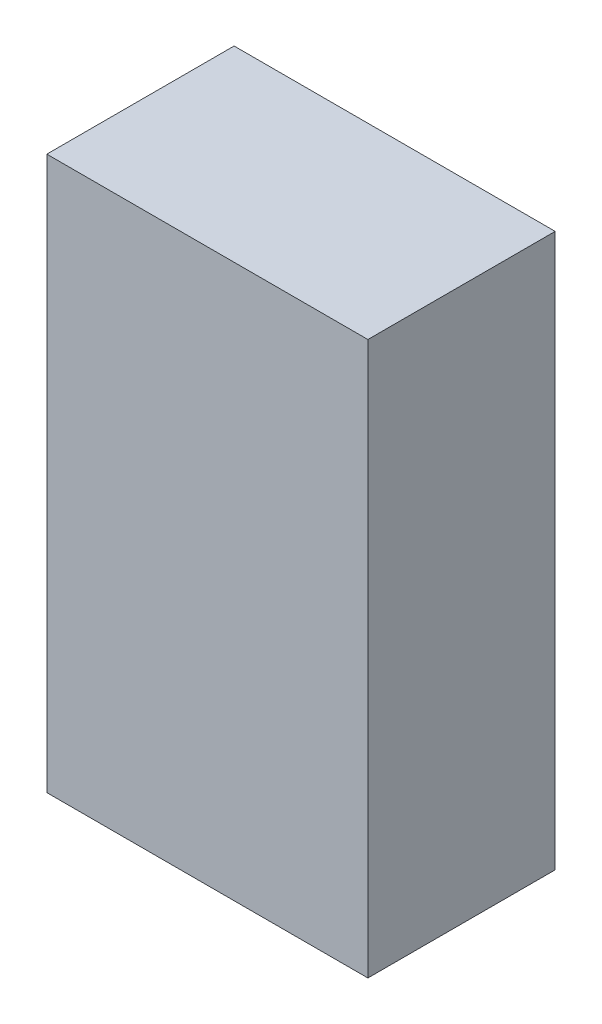
ISO-10303-21;
HEADER;
FILE_DESCRIPTION(('STEP AP214'),'2;1');
FILE_NAME('part.step','',(''),(''),'','','');
FILE_SCHEMA(('AUTOMOTIVE_DESIGN { 1 0 10303 214 1 1 1 1 }'));
ENDSEC;
DATA;
#1=APPLICATION_CONTEXT('core data for automotive mechanical design processes');
#2=APPLICATION_PROTOCOL_DEFINITION('international standard','automotive_design',2000,#1);
#3=PRODUCT_CONTEXT('',#1,'mechanical');
#4=PRODUCT('Part','Part','',(#3));
#5=PRODUCT_RELATED_PRODUCT_CATEGORY('part','',(#4));
#6=PRODUCT_DEFINITION_FORMATION('','',#4);
#7=PRODUCT_DEFINITION_CONTEXT('part definition',#1,'design');
#8=PRODUCT_DEFINITION('design','',#6,#7);
#9=PRODUCT_DEFINITION_SHAPE('','',#8);
#10=(LENGTH_UNIT() NAMED_UNIT(*) SI_UNIT(.MILLI.,.METRE.));
#11=(NAMED_UNIT(*) PLANE_ANGLE_UNIT() SI_UNIT($,.RADIAN.));
#12=(NAMED_UNIT(*) SI_UNIT($,.STERADIAN.) SOLID_ANGLE_UNIT());
#13=UNCERTAINTY_MEASURE_WITH_UNIT(LENGTH_MEASURE(1.E-05),#10,'distance_accuracy_value','');
#14=(GEOMETRIC_REPRESENTATION_CONTEXT(3) GLOBAL_UNCERTAINTY_ASSIGNED_CONTEXT((#13)) GLOBAL_UNIT_ASSIGNED_CONTEXT((#10,
#11,#12)) REPRESENTATION_CONTEXT('',''));
#15=CARTESIAN_POINT('',(0.,0.,0.));
#16=DIRECTION('',(0.,0.,1.));
#17=DIRECTION('',(1.,0.,0.));
#18=AXIS2_PLACEMENT_3D('',#15,#16,#17);
#19=CARTESIAN_POINT('',(0.90000074,-1.54999944,1.05000044));
#20=DIRECTION('',(0.,0.,-1.));
#21=DIRECTION('',(-1.,0.,0.));
#22=AXIS2_PLACEMENT_3D('',#19,#20,#21);
#23=PLANE('',#22);
#24=DIRECTION('',(1.,0.,0.));
#25=VECTOR('',#24,1.);
#26=CARTESIAN_POINT('',(0.90000074,1.54999944,1.05000044));
#27=LINE('',#26,#25);
#28=CARTESIAN_POINT('',(0.90000074,1.54999944,1.05000044));
#29=VERTEX_POINT('',#28);
#30=CARTESIAN_POINT('',(-0.90000074,1.54999944,1.05000044));
#31=VERTEX_POINT('',#30);
#32=EDGE_CURVE('E54',#29,#31,#27,.F.);
#33=ORIENTED_EDGE('',*,*,#32,.T.);
#34=DIRECTION('',(0.,1.,0.));
#35=VECTOR('',#34,1.);
#36=CARTESIAN_POINT('',(-0.90000074,1.54999944,1.05000044));
#37=LINE('',#36,#35);
#38=CARTESIAN_POINT('',(-0.90000074,-1.54999944,1.05000044));
#39=VERTEX_POINT('',#38);
#40=EDGE_CURVE('E56',#31,#39,#37,.F.);
#41=ORIENTED_EDGE('',*,*,#40,.T.);
#42=DIRECTION('',(1.,0.,0.));
#43=VECTOR('',#42,1.);
#44=CARTESIAN_POINT('',(-0.90000074,-1.54999944,1.05000044));
#45=LINE('',#44,#43);
#46=CARTESIAN_POINT('',(0.90000074,-1.54999944,1.05000044));
#47=VERTEX_POINT('',#46);
#48=EDGE_CURVE('E19',#39,#47,#45,.T.);
#49=ORIENTED_EDGE('',*,*,#48,.T.);
#50=DIRECTION('',(0.,1.,0.));
#51=VECTOR('',#50,1.);
#52=CARTESIAN_POINT('',(0.90000074,-1.54999944,1.05000044));
#53=LINE('',#52,#51);
#54=EDGE_CURVE('E79',#47,#29,#53,.T.);
#55=ORIENTED_EDGE('',*,*,#54,.T.);
#56=EDGE_LOOP('',(#33,#41,#49,#55));
#57=FACE_BOUND('',#56,.T.);
#58=ADVANCED_FACE('F16',(#57),#23,.F.);
#59=CARTESIAN_POINT('',(-0.90000074,-1.54999944,0.));
#60=DIRECTION('',(0.,1.,0.));
#61=DIRECTION('',(0.,0.,1.));
#62=AXIS2_PLACEMENT_3D('',#59,#60,#61);
#63=PLANE('',#62);
#64=DIRECTION('',(0.,0.,1.));
#65=VECTOR('',#64,1.);
#66=CARTESIAN_POINT('',(0.90000074,-1.54999944,0.));
#67=LINE('',#66,#65);
#68=CARTESIAN_POINT('',(0.90000074,-1.54999944,0.));
#69=VERTEX_POINT('',#68);
#70=EDGE_CURVE('E67',#69,#47,#67,.T.);
#71=ORIENTED_EDGE('',*,*,#70,.T.);
#72=ORIENTED_EDGE('',*,*,#48,.F.);
#73=DIRECTION('',(0.,0.,-1.));
#74=VECTOR('',#73,1.);
#75=CARTESIAN_POINT('',(-0.90000074,-1.54999944,0.));
#76=LINE('',#75,#74);
#77=CARTESIAN_POINT('',(-0.90000074,-1.54999944,0.));
#78=VERTEX_POINT('',#77);
#79=EDGE_CURVE('E62',#39,#78,#76,.T.);
#80=ORIENTED_EDGE('',*,*,#79,.T.);
#81=DIRECTION('',(-1.,0.,0.));
#82=VECTOR('',#81,1.);
#83=CARTESIAN_POINT('',(0.90000074,-1.54999944,0.));
#84=LINE('',#83,#82);
#85=EDGE_CURVE('E82',#69,#78,#84,.T.);
#86=ORIENTED_EDGE('',*,*,#85,.F.);
#87=EDGE_LOOP('',(#71,#72,#80,#86));
#88=FACE_BOUND('',#87,.T.);
#89=ADVANCED_FACE('F64',(#88),#63,.F.);
#90=CARTESIAN_POINT('',(-0.90000074,1.54999944,0.));
#91=DIRECTION('',(1.,0.,0.));
#92=DIRECTION('',(0.,0.,-1.));
#93=AXIS2_PLACEMENT_3D('',#90,#91,#92);
#94=PLANE('',#93);
#95=ORIENTED_EDGE('',*,*,#79,.F.);
#96=ORIENTED_EDGE('',*,*,#40,.F.);
#97=DIRECTION('',(0.,0.,-1.));
#98=VECTOR('',#97,1.);
#99=CARTESIAN_POINT('',(-0.90000074,1.54999944,0.));
#100=LINE('',#99,#98);
#101=CARTESIAN_POINT('',(-0.90000074,1.54999944,0.));
#102=VERTEX_POINT('',#101);
#103=EDGE_CURVE('E74',#31,#102,#100,.T.);
#104=ORIENTED_EDGE('',*,*,#103,.T.);
#105=DIRECTION('',(0.,1.,0.));
#106=VECTOR('',#105,1.);
#107=CARTESIAN_POINT('',(-0.90000074,-1.54999944,0.));
#108=LINE('',#107,#106);
#109=EDGE_CURVE('E71',#78,#102,#108,.T.);
#110=ORIENTED_EDGE('',*,*,#109,.F.);
#111=EDGE_LOOP('',(#95,#96,#104,#110));
#112=FACE_BOUND('',#111,.T.);
#113=ADVANCED_FACE('F69',(#112),#94,.F.);
#114=CARTESIAN_POINT('',(0.90000074,1.54999944,0.));
#115=DIRECTION('',(0.,-1.,0.));
#116=DIRECTION('',(0.,0.,-1.));
#117=AXIS2_PLACEMENT_3D('',#114,#115,#116);
#118=PLANE('',#117);
#119=ORIENTED_EDGE('',*,*,#103,.F.);
#120=ORIENTED_EDGE('',*,*,#32,.F.);
#121=DIRECTION('',(0.,0.,1.));
#122=VECTOR('',#121,1.);
#123=CARTESIAN_POINT('',(0.90000074,1.54999944,0.));
#124=LINE('',#123,#122);
#125=CARTESIAN_POINT('',(0.90000074,1.54999944,0.));
#126=VERTEX_POINT('',#125);
#127=EDGE_CURVE('E34',#29,#126,#124,.F.);
#128=ORIENTED_EDGE('',*,*,#127,.T.);
#129=DIRECTION('',(-1.,0.,0.));
#130=VECTOR('',#129,1.);
#131=CARTESIAN_POINT('',(0.90000074,1.54999944,0.));
#132=LINE('',#131,#130);
#133=EDGE_CURVE('E25',#102,#126,#132,.F.);
#134=ORIENTED_EDGE('',*,*,#133,.F.);
#135=EDGE_LOOP('',(#119,#120,#128,#134));
#136=FACE_BOUND('',#135,.T.);
#137=ADVANCED_FACE('F88',(#136),#118,.F.);
#138=CARTESIAN_POINT('',(0.90000074,-1.54999944,0.));
#139=DIRECTION('',(-1.,0.,0.));
#140=DIRECTION('',(0.,0.,1.));
#141=AXIS2_PLACEMENT_3D('',#138,#139,#140);
#142=PLANE('',#141);
#143=ORIENTED_EDGE('',*,*,#127,.F.);
#144=ORIENTED_EDGE('',*,*,#54,.F.);
#145=ORIENTED_EDGE('',*,*,#70,.F.);
#146=DIRECTION('',(0.,1.,0.));
#147=VECTOR('',#146,1.);
#148=CARTESIAN_POINT('',(0.90000074,-1.54999944,0.));
#149=LINE('',#148,#147);
#150=EDGE_CURVE('E11',#126,#69,#149,.F.);
#151=ORIENTED_EDGE('',*,*,#150,.F.);
#152=EDGE_LOOP('',(#143,#144,#145,#151));
#153=FACE_BOUND('',#152,.T.);
#154=ADVANCED_FACE('F90',(#153),#142,.F.);
#155=CARTESIAN_POINT('',(0.90000074,-1.54999944,0.));
#156=DIRECTION('',(0.,0.,-1.));
#157=DIRECTION('',(-1.,0.,0.));
#158=AXIS2_PLACEMENT_3D('',#155,#156,#157);
#159=PLANE('',#158);
#160=ORIENTED_EDGE('',*,*,#133,.T.);
#161=ORIENTED_EDGE('',*,*,#150,.T.);
#162=ORIENTED_EDGE('',*,*,#85,.T.);
#163=ORIENTED_EDGE('',*,*,#109,.T.);
#164=EDGE_LOOP('',(#160,#161,#162,#163));
#165=FACE_BOUND('',#164,.T.);
#166=ADVANCED_FACE('F87',(#165),#159,.T.);
#167=CLOSED_SHELL('',(#58,#89,#113,#137,#154,#166));
#168=MANIFOLD_SOLID_BREP('B1',#167);
#169=ADVANCED_BREP_SHAPE_REPRESENTATION('',(#18,#168),#14);
#170=SHAPE_DEFINITION_REPRESENTATION(#9,#169);
ENDSEC;
END-ISO-10303-21;
